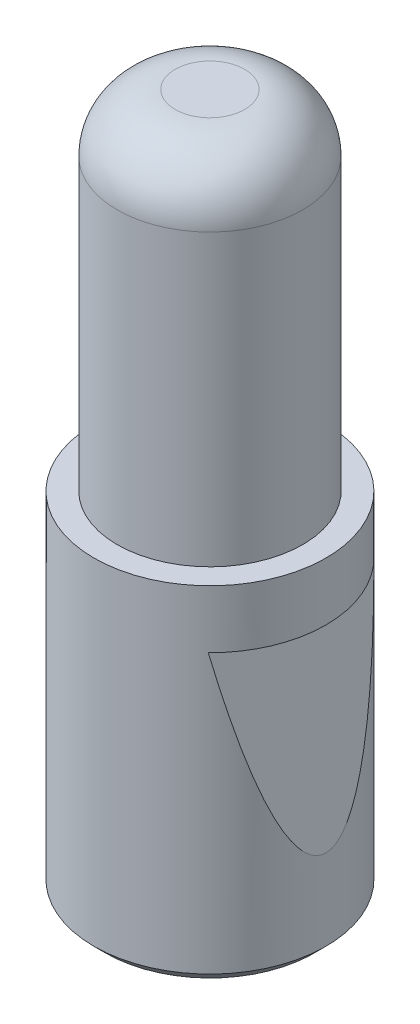
ISO-10303-21;
HEADER;
FILE_DESCRIPTION(('STEP AP214'),'2;1');
FILE_NAME('part.step','',(''),(''),'','','');
FILE_SCHEMA(('AUTOMOTIVE_DESIGN { 1 0 10303 214 1 1 1 1 }'));
ENDSEC;
DATA;
#1=APPLICATION_CONTEXT('core data for automotive mechanical design processes');
#2=APPLICATION_PROTOCOL_DEFINITION('international standard','automotive_design',2000,#1);
#3=PRODUCT_CONTEXT('',#1,'mechanical');
#4=PRODUCT('Part','Part','',(#3));
#5=PRODUCT_RELATED_PRODUCT_CATEGORY('part','',(#4));
#6=PRODUCT_DEFINITION_FORMATION('','',#4);
#7=PRODUCT_DEFINITION_CONTEXT('part definition',#1,'design');
#8=PRODUCT_DEFINITION('design','',#6,#7);
#9=PRODUCT_DEFINITION_SHAPE('','',#8);
#10=(LENGTH_UNIT() NAMED_UNIT(*) SI_UNIT(.MILLI.,.METRE.));
#11=(NAMED_UNIT(*) PLANE_ANGLE_UNIT() SI_UNIT($,.RADIAN.));
#12=(NAMED_UNIT(*) SI_UNIT($,.STERADIAN.) SOLID_ANGLE_UNIT());
#13=UNCERTAINTY_MEASURE_WITH_UNIT(LENGTH_MEASURE(1.E-05),#10,'distance_accuracy_value','');
#14=(GEOMETRIC_REPRESENTATION_CONTEXT(3) GLOBAL_UNCERTAINTY_ASSIGNED_CONTEXT((#13)) GLOBAL_UNIT_ASSIGNED_CONTEXT((#10,
#11,#12)) REPRESENTATION_CONTEXT('',''));
#15=CARTESIAN_POINT('',(0.,0.,0.));
#16=DIRECTION('',(0.,0.,1.));
#17=DIRECTION('',(1.,0.,0.));
#18=AXIS2_PLACEMENT_3D('',#15,#16,#17);
#19=CARTESIAN_POINT('',(0.,30.,0.));
#20=DIRECTION('',(0.,1.,0.));
#21=DIRECTION('',(0.,0.,1.));
#22=AXIS2_PLACEMENT_3D('',#19,#20,#21);
#23=PLANE('',#22);
#24=CARTESIAN_POINT('',(0.,30.,0.));
#25=DIRECTION('',(0.,1.,0.));
#26=DIRECTION('',(0.,0.,1.));
#27=AXIS2_PLACEMENT_3D('',#24,#25,#26);
#28=CIRCLE('',#27,10.);
#29=CARTESIAN_POINT('',(0.,30.,10.));
#30=VERTEX_POINT('',#29);
#31=EDGE_CURVE('E44',#30,#30,#28,.T.);
#32=ORIENTED_EDGE('',*,*,#31,.T.);
#33=EDGE_LOOP('',(#32));
#34=FACE_BOUND('',#33,.T.);
#35=CARTESIAN_POINT('',(0.,30.,0.));
#36=DIRECTION('',(0.,1.,0.));
#37=DIRECTION('',(0.,0.,1.));
#38=AXIS2_PLACEMENT_3D('',#35,#36,#37);
#39=CIRCLE('',#38,8.);
#40=CARTESIAN_POINT('',(0.,30.,8.));
#41=VERTEX_POINT('',#40);
#42=EDGE_CURVE('E47',#41,#41,#39,.T.);
#43=ORIENTED_EDGE('',*,*,#42,.F.);
#44=EDGE_LOOP('',(#43));
#45=FACE_BOUND('',#44,.T.);
#46=ADVANCED_FACE('F17',(#34,#45),#23,.T.);
#47=CARTESIAN_POINT('',(0.,30.,0.));
#48=DIRECTION('',(0.,-1.,0.));
#49=DIRECTION('',(0.,0.,-1.));
#50=AXIS2_PLACEMENT_3D('',#47,#48,#49);
#51=CYLINDRICAL_SURFACE('',#50,10.);
#52=CARTESIAN_POINT('',(0.,1.,0.));
#53=DIRECTION('',(0.,1.,0.));
#54=DIRECTION('',(0.,0.,1.));
#55=AXIS2_PLACEMENT_3D('',#52,#53,#54);
#56=CIRCLE('',#55,10.);
#57=CARTESIAN_POINT('',(0.,1.,10.));
#58=VERTEX_POINT('',#57);
#59=EDGE_CURVE('E41',#58,#58,#56,.T.);
#60=ORIENTED_EDGE('',*,*,#59,.T.);
#61=EDGE_LOOP('',(#60));
#62=FACE_BOUND('',#61,.T.);
#63=CARTESIAN_POINT('',(0.,64.6989727373255,0.));
#64=DIRECTION('',(-0.984807753012209,-0.173648177666924,0.));
#65=DIRECTION('',(0.173648177666924,-0.984807753012209,0.));
#66=AXIS2_PLACEMENT_3D('',#63,#64,#65);
#67=ELLIPSE('',#66,57.5877048314386,10.);
#68=CARTESIAN_POINT('',(7.,25.,-7.14142842854285));
#69=VERTEX_POINT('',#68);
#70=CARTESIAN_POINT('',(7.,25.,7.14142842854285));
#71=VERTEX_POINT('',#70);
#72=EDGE_CURVE('E36',#69,#71,#67,.T.);
#73=ORIENTED_EDGE('',*,*,#72,.T.);
#74=CARTESIAN_POINT('',(0.,25.,0.));
#75=DIRECTION('',(0.,1.,0.));
#76=DIRECTION('',(0.,0.,1.));
#77=AXIS2_PLACEMENT_3D('',#74,#75,#76);
#78=CIRCLE('',#77,10.);
#79=EDGE_CURVE('E39',#71,#69,#78,.T.);
#80=ORIENTED_EDGE('',*,*,#79,.T.);
#81=EDGE_LOOP('',(#73,#80));
#82=FACE_BOUND('',#81,.T.);
#83=ORIENTED_EDGE('',*,*,#31,.F.);
#84=EDGE_LOOP('',(#83));
#85=FACE_BOUND('',#84,.T.);
#86=ADVANCED_FACE('F37',(#62,#82,#85),#51,.T.);
#87=CARTESIAN_POINT('',(0.,0.,0.));
#88=DIRECTION('',(0.,1.,0.));
#89=DIRECTION('',(0.,0.,1.));
#90=AXIS2_PLACEMENT_3D('',#87,#88,#89);
#91=PLANE('',#90);
#92=CARTESIAN_POINT('',(0.,0.,0.));
#93=DIRECTION('',(0.,1.,0.));
#94=DIRECTION('',(0.,0.,1.));
#95=AXIS2_PLACEMENT_3D('',#92,#93,#94);
#96=CIRCLE('',#95,9.);
#97=CARTESIAN_POINT('',(0.,0.,9.));
#98=VERTEX_POINT('',#97);
#99=EDGE_CURVE('E56',#98,#98,#96,.F.);
#100=ORIENTED_EDGE('',*,*,#99,.T.);
#101=EDGE_LOOP('',(#100));
#102=FACE_BOUND('',#101,.T.);
#103=ADVANCED_FACE('F80',(#102),#91,.F.);
#104=CARTESIAN_POINT('',(0.,60.,0.));
#105=DIRECTION('',(0.,-1.,0.));
#106=DIRECTION('',(0.,0.,-1.));
#107=AXIS2_PLACEMENT_3D('',#104,#105,#106);
#108=CYLINDRICAL_SURFACE('',#107,8.);
#109=CARTESIAN_POINT('',(0.,55.,0.));
#110=DIRECTION('',(0.,1.,0.));
#111=DIRECTION('',(0.,0.,1.));
#112=AXIS2_PLACEMENT_3D('',#109,#110,#111);
#113=CIRCLE('',#112,8.);
#114=CARTESIAN_POINT('',(0.,55.,8.));
#115=VERTEX_POINT('',#114);
#116=EDGE_CURVE('E11',#115,#115,#113,.F.);
#117=ORIENTED_EDGE('',*,*,#116,.T.);
#118=EDGE_LOOP('',(#117));
#119=FACE_BOUND('',#118,.T.);
#120=ORIENTED_EDGE('',*,*,#42,.T.);
#121=EDGE_LOOP('',(#120));
#122=FACE_BOUND('',#121,.T.);
#123=ADVANCED_FACE('F86',(#119,#122),#108,.T.);
#124=CARTESIAN_POINT('',(0.,60.,0.));
#125=DIRECTION('',(0.,1.,0.));
#126=DIRECTION('',(0.,0.,1.));
#127=AXIS2_PLACEMENT_3D('',#124,#125,#126);
#128=PLANE('',#127);
#129=CARTESIAN_POINT('',(0.,60.,0.));
#130=DIRECTION('',(0.,1.,0.));
#131=DIRECTION('',(0.,0.,1.));
#132=AXIS2_PLACEMENT_3D('',#129,#130,#131);
#133=CIRCLE('',#132,3.);
#134=CARTESIAN_POINT('',(0.,60.,3.));
#135=VERTEX_POINT('',#134);
#136=EDGE_CURVE('E25',#135,#135,#133,.T.);
#137=ORIENTED_EDGE('',*,*,#136,.T.);
#138=EDGE_LOOP('',(#137));
#139=FACE_BOUND('',#138,.T.);
#140=ADVANCED_FACE('F61',(#139),#128,.T.);
#141=CARTESIAN_POINT('',(7.,25.,-10.));
#142=DIRECTION('',(-0.984807753012209,-0.173648177666924,0.));
#143=DIRECTION('',(0.173648177666924,-0.984807753012209,0.));
#144=AXIS2_PLACEMENT_3D('',#141,#142,#143);
#145=PLANE('',#144);
#146=ORIENTED_EDGE('',*,*,#72,.F.);
#147=DIRECTION('',(0.,0.,1.));
#148=VECTOR('',#147,1.);
#149=CARTESIAN_POINT('',(7.,25.,-10.));
#150=LINE('',#149,#148);
#151=EDGE_CURVE('E31',#69,#71,#150,.T.);
#152=ORIENTED_EDGE('',*,*,#151,.T.);
#153=EDGE_LOOP('',(#146,#152));
#154=FACE_BOUND('',#153,.T.);
#155=ADVANCED_FACE('F46',(#154),#145,.F.);
#156=CARTESIAN_POINT('',(10.,25.,-10.));
#157=DIRECTION('',(0.,1.,0.));
#158=DIRECTION('',(0.,0.,1.));
#159=AXIS2_PLACEMENT_3D('',#156,#157,#158);
#160=PLANE('',#159);
#161=ORIENTED_EDGE('',*,*,#151,.F.);
#162=ORIENTED_EDGE('',*,*,#79,.F.);
#163=EDGE_LOOP('',(#161,#162));
#164=FACE_BOUND('',#163,.T.);
#165=ADVANCED_FACE('F43',(#164),#160,.F.);
#166=CARTESIAN_POINT('',(0.,1.,0.));
#167=DIRECTION('',(0.,1.,0.));
#168=DIRECTION('',(0.,0.,1.));
#169=AXIS2_PLACEMENT_3D('',#166,#167,#168);
#170=CONICAL_SURFACE('',#169,10.,0.785398163397452);
#171=ORIENTED_EDGE('',*,*,#99,.F.);
#172=EDGE_LOOP('',(#171));
#173=FACE_BOUND('',#172,.T.);
#174=ORIENTED_EDGE('',*,*,#59,.F.);
#175=EDGE_LOOP('',(#174));
#176=FACE_BOUND('',#175,.T.);
#177=ADVANCED_FACE('F64',(#173,#176),#170,.T.);
#178=CARTESIAN_POINT('',(0.,55.,0.));
#179=DIRECTION('',(0.,1.,0.));
#180=DIRECTION('',(0.,0.,1.));
#181=AXIS2_PLACEMENT_3D('',#178,#179,#180);
#182=DEGENERATE_TOROIDAL_SURFACE('',#181,3.,5.,.T.);
#183=ORIENTED_EDGE('',*,*,#116,.F.);
#184=EDGE_LOOP('',(#183));
#185=FACE_BOUND('',#184,.T.);
#186=ORIENTED_EDGE('',*,*,#136,.F.);
#187=EDGE_LOOP('',(#186));
#188=FACE_BOUND('',#187,.T.);
#189=ADVANCED_FACE('F19',(#185,#188),#182,.T.);
#190=CLOSED_SHELL('',(#46,#86,#103,#123,#140,#155,#165,#177,#189));
#191=MANIFOLD_SOLID_BREP('B1',#190);
#192=ADVANCED_BREP_SHAPE_REPRESENTATION('',(#18,#191),#14);
#193=SHAPE_DEFINITION_REPRESENTATION(#9,#192);
ENDSEC;
END-ISO-10303-21;
